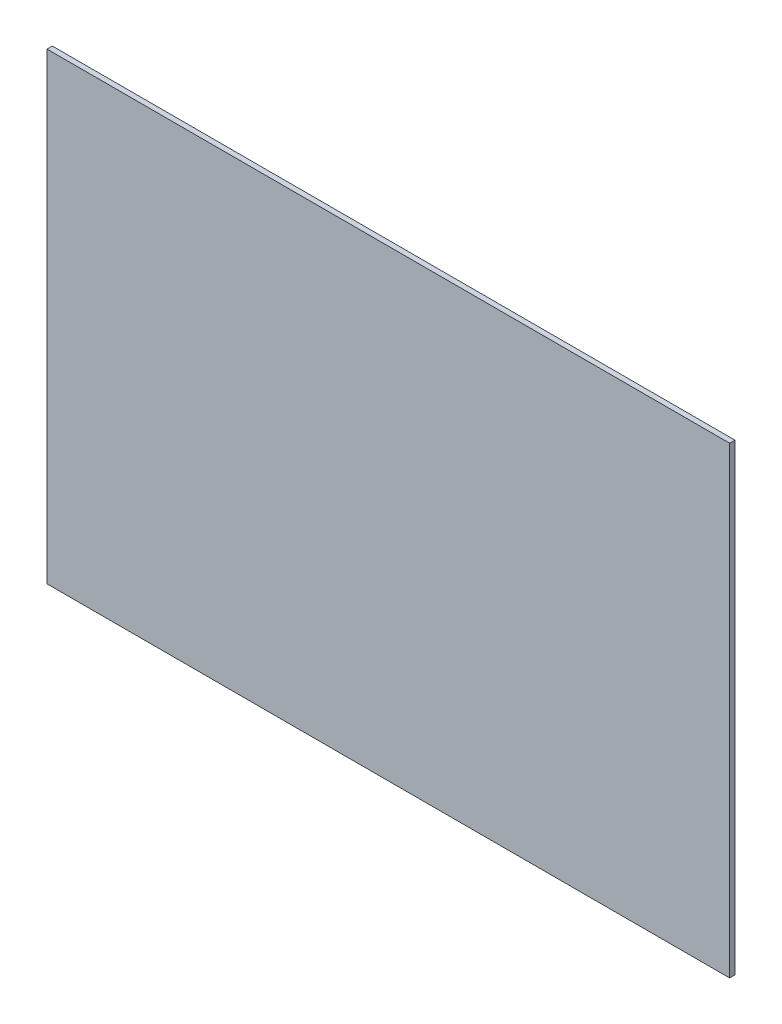
ISO-10303-21;
HEADER;
FILE_DESCRIPTION(('STEP AP214'),'2;1');
FILE_NAME('part.step','',(''),(''),'','','');
FILE_SCHEMA(('AUTOMOTIVE_DESIGN { 1 0 10303 214 1 1 1 1 }'));
ENDSEC;
DATA;
#1=APPLICATION_CONTEXT('core data for automotive mechanical design processes');
#2=APPLICATION_PROTOCOL_DEFINITION('international standard','automotive_design',2000,#1);
#3=PRODUCT_CONTEXT('',#1,'mechanical');
#4=PRODUCT('Part','Part','',(#3));
#5=PRODUCT_RELATED_PRODUCT_CATEGORY('part','',(#4));
#6=PRODUCT_DEFINITION_FORMATION('','',#4);
#7=PRODUCT_DEFINITION_CONTEXT('part definition',#1,'design');
#8=PRODUCT_DEFINITION('design','',#6,#7);
#9=PRODUCT_DEFINITION_SHAPE('','',#8);
#10=(LENGTH_UNIT() NAMED_UNIT(*) SI_UNIT(.MILLI.,.METRE.));
#11=(NAMED_UNIT(*) PLANE_ANGLE_UNIT() SI_UNIT($,.RADIAN.));
#12=(NAMED_UNIT(*) SI_UNIT($,.STERADIAN.) SOLID_ANGLE_UNIT());
#13=UNCERTAINTY_MEASURE_WITH_UNIT(LENGTH_MEASURE(1.E-05),#10,'distance_accuracy_value','');
#14=(GEOMETRIC_REPRESENTATION_CONTEXT(3) GLOBAL_UNCERTAINTY_ASSIGNED_CONTEXT((#13)) GLOBAL_UNIT_ASSIGNED_CONTEXT((#10,
#11,#12)) REPRESENTATION_CONTEXT('',''));
#15=CARTESIAN_POINT('',(0.,0.,0.));
#16=DIRECTION('',(0.,0.,1.));
#17=DIRECTION('',(1.,0.,0.));
#18=AXIS2_PLACEMENT_3D('',#15,#16,#17);
#19=CARTESIAN_POINT('',(256.5,-174.,4.));
#20=DIRECTION('',(-1.,0.,0.));
#21=DIRECTION('',(0.,0.,1.));
#22=AXIS2_PLACEMENT_3D('',#19,#20,#21);
#23=PLANE('',#22);
#24=DIRECTION('',(0.,1.,0.));
#25=VECTOR('',#24,1.);
#26=CARTESIAN_POINT('',(256.5,-174.,0.));
#27=LINE('',#26,#25);
#28=CARTESIAN_POINT('',(256.5,-174.,0.));
#29=VERTEX_POINT('',#28);
#30=CARTESIAN_POINT('',(256.5,174.,0.));
#31=VERTEX_POINT('',#30);
#32=EDGE_CURVE('E96',#29,#31,#27,.T.);
#33=ORIENTED_EDGE('',*,*,#32,.T.);
#34=DIRECTION('',(0.,0.,-1.));
#35=VECTOR('',#34,1.);
#36=CARTESIAN_POINT('',(256.5,174.,4.));
#37=LINE('',#36,#35);
#38=CARTESIAN_POINT('',(256.5,174.,4.));
#39=VERTEX_POINT('',#38);
#40=EDGE_CURVE('E11',#39,#31,#37,.T.);
#41=ORIENTED_EDGE('',*,*,#40,.F.);
#42=DIRECTION('',(0.,1.,0.));
#43=VECTOR('',#42,1.);
#44=CARTESIAN_POINT('',(256.5,-174.,4.));
#45=LINE('',#44,#43);
#46=CARTESIAN_POINT('',(256.5,-174.,4.));
#47=VERTEX_POINT('',#46);
#48=EDGE_CURVE('E84',#47,#39,#45,.T.);
#49=ORIENTED_EDGE('',*,*,#48,.F.);
#50=DIRECTION('',(0.,0.,-1.));
#51=VECTOR('',#50,1.);
#52=CARTESIAN_POINT('',(256.5,-174.,4.));
#53=LINE('',#52,#51);
#54=EDGE_CURVE('E92',#47,#29,#53,.T.);
#55=ORIENTED_EDGE('',*,*,#54,.T.);
#56=EDGE_LOOP('',(#33,#41,#49,#55));
#57=FACE_BOUND('',#56,.T.);
#58=ADVANCED_FACE('F33',(#57),#23,.F.);
#59=CARTESIAN_POINT('',(-256.5,174.,4.));
#60=DIRECTION('',(0.,-1.,0.));
#61=DIRECTION('',(0.,0.,-1.));
#62=AXIS2_PLACEMENT_3D('',#59,#60,#61);
#63=PLANE('',#62);
#64=DIRECTION('',(-1.,0.,0.));
#65=VECTOR('',#64,1.);
#66=CARTESIAN_POINT('',(-256.5,174.,0.));
#67=LINE('',#66,#65);
#68=CARTESIAN_POINT('',(-256.5,174.,0.));
#69=VERTEX_POINT('',#68);
#70=EDGE_CURVE('E88',#31,#69,#67,.T.);
#71=ORIENTED_EDGE('',*,*,#70,.T.);
#72=DIRECTION('',(0.,0.,-1.));
#73=VECTOR('',#72,1.);
#74=CARTESIAN_POINT('',(-256.5,174.,4.));
#75=LINE('',#74,#73);
#76=CARTESIAN_POINT('',(-256.5,174.,4.));
#77=VERTEX_POINT('',#76);
#78=EDGE_CURVE('E41',#77,#69,#75,.T.);
#79=ORIENTED_EDGE('',*,*,#78,.F.);
#80=DIRECTION('',(-1.,0.,0.));
#81=VECTOR('',#80,1.);
#82=CARTESIAN_POINT('',(-256.5,174.,4.));
#83=LINE('',#82,#81);
#84=EDGE_CURVE('E79',#39,#77,#83,.T.);
#85=ORIENTED_EDGE('',*,*,#84,.F.);
#86=ORIENTED_EDGE('',*,*,#40,.T.);
#87=EDGE_LOOP('',(#71,#79,#85,#86));
#88=FACE_BOUND('',#87,.T.);
#89=ADVANCED_FACE('F87',(#88),#63,.F.);
#90=CARTESIAN_POINT('',(-256.5,-174.,4.));
#91=DIRECTION('',(1.,0.,0.));
#92=DIRECTION('',(0.,0.,-1.));
#93=AXIS2_PLACEMENT_3D('',#90,#91,#92);
#94=PLANE('',#93);
#95=DIRECTION('',(0.,-1.,0.));
#96=VECTOR('',#95,1.);
#97=CARTESIAN_POINT('',(-256.5,-174.,0.));
#98=LINE('',#97,#96);
#99=CARTESIAN_POINT('',(-256.5,-174.,0.));
#100=VERTEX_POINT('',#99);
#101=EDGE_CURVE('E66',#69,#100,#98,.T.);
#102=ORIENTED_EDGE('',*,*,#101,.T.);
#103=DIRECTION('',(0.,0.,-1.));
#104=VECTOR('',#103,1.);
#105=CARTESIAN_POINT('',(-256.5,-174.,4.));
#106=LINE('',#105,#104);
#107=CARTESIAN_POINT('',(-256.5,-174.,4.));
#108=VERTEX_POINT('',#107);
#109=EDGE_CURVE('E89',#108,#100,#106,.T.);
#110=ORIENTED_EDGE('',*,*,#109,.F.);
#111=DIRECTION('',(0.,-1.,0.));
#112=VECTOR('',#111,1.);
#113=CARTESIAN_POINT('',(-256.5,-174.,4.));
#114=LINE('',#113,#112);
#115=EDGE_CURVE('E82',#77,#108,#114,.T.);
#116=ORIENTED_EDGE('',*,*,#115,.F.);
#117=ORIENTED_EDGE('',*,*,#78,.T.);
#118=EDGE_LOOP('',(#102,#110,#116,#117));
#119=FACE_BOUND('',#118,.T.);
#120=ADVANCED_FACE('F90',(#119),#94,.F.);
#121=CARTESIAN_POINT('',(-256.5,-174.,4.));
#122=DIRECTION('',(0.,1.,0.));
#123=DIRECTION('',(0.,0.,1.));
#124=AXIS2_PLACEMENT_3D('',#121,#122,#123);
#125=PLANE('',#124);
#126=DIRECTION('',(1.,0.,0.));
#127=VECTOR('',#126,1.);
#128=CARTESIAN_POINT('',(-256.5,-174.,0.));
#129=LINE('',#128,#127);
#130=EDGE_CURVE('E72',#100,#29,#129,.T.);
#131=ORIENTED_EDGE('',*,*,#130,.T.);
#132=ORIENTED_EDGE('',*,*,#54,.F.);
#133=DIRECTION('',(1.,0.,0.));
#134=VECTOR('',#133,1.);
#135=CARTESIAN_POINT('',(-256.5,-174.,4.));
#136=LINE('',#135,#134);
#137=EDGE_CURVE('E49',#108,#47,#136,.T.);
#138=ORIENTED_EDGE('',*,*,#137,.F.);
#139=ORIENTED_EDGE('',*,*,#109,.T.);
#140=EDGE_LOOP('',(#131,#132,#138,#139));
#141=FACE_BOUND('',#140,.T.);
#142=ADVANCED_FACE('F103',(#141),#125,.F.);
#143=CARTESIAN_POINT('',(0.,0.,4.));
#144=DIRECTION('',(0.,0.,-1.));
#145=DIRECTION('',(-1.,0.,0.));
#146=AXIS2_PLACEMENT_3D('',#143,#144,#145);
#147=PLANE('',#146);
#148=ORIENTED_EDGE('',*,*,#48,.T.);
#149=ORIENTED_EDGE('',*,*,#84,.T.);
#150=ORIENTED_EDGE('',*,*,#115,.T.);
#151=ORIENTED_EDGE('',*,*,#137,.T.);
#152=EDGE_LOOP('',(#148,#149,#150,#151));
#153=FACE_BOUND('',#152,.T.);
#154=ADVANCED_FACE('F80',(#153),#147,.F.);
#155=CARTESIAN_POINT('',(0.,0.,0.));
#156=DIRECTION('',(0.,0.,-1.));
#157=DIRECTION('',(-1.,0.,0.));
#158=AXIS2_PLACEMENT_3D('',#155,#156,#157);
#159=PLANE('',#158);
#160=ORIENTED_EDGE('',*,*,#32,.F.);
#161=ORIENTED_EDGE('',*,*,#130,.F.);
#162=ORIENTED_EDGE('',*,*,#101,.F.);
#163=ORIENTED_EDGE('',*,*,#70,.F.);
#164=EDGE_LOOP('',(#160,#161,#162,#163));
#165=FACE_BOUND('',#164,.T.);
#166=ADVANCED_FACE('F106',(#165),#159,.T.);
#167=CLOSED_SHELL('',(#58,#89,#120,#142,#154,#166));
#168=MANIFOLD_SOLID_BREP('B2',#167);
#169=ADVANCED_BREP_SHAPE_REPRESENTATION('',(#18,#168),#14);
#170=SHAPE_DEFINITION_REPRESENTATION(#9,#169);
ENDSEC;
END-ISO-10303-21;
